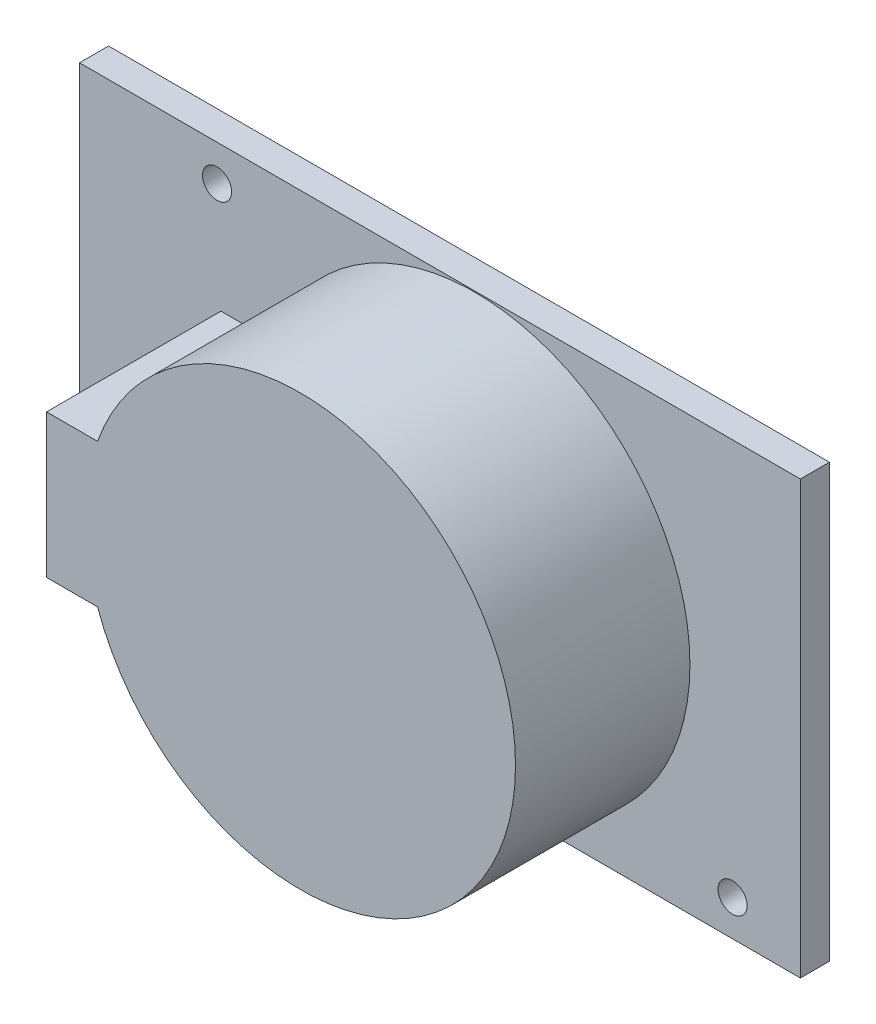
ISO-10303-21;
HEADER;
FILE_DESCRIPTION(('STEP AP214'),'2;1');
FILE_NAME('part.step','',(''),(''),'','','');
FILE_SCHEMA(('AUTOMOTIVE_DESIGN { 1 0 10303 214 1 1 1 1 }'));
ENDSEC;
DATA;
#1=APPLICATION_CONTEXT('core data for automotive mechanical design processes');
#2=APPLICATION_PROTOCOL_DEFINITION('international standard','automotive_design',2000,#1);
#3=PRODUCT_CONTEXT('',#1,'mechanical');
#4=PRODUCT('Part','Part','',(#3));
#5=PRODUCT_RELATED_PRODUCT_CATEGORY('part','',(#4));
#6=PRODUCT_DEFINITION_FORMATION('','',#4);
#7=PRODUCT_DEFINITION_CONTEXT('part definition',#1,'design');
#8=PRODUCT_DEFINITION('design','',#6,#7);
#9=PRODUCT_DEFINITION_SHAPE('','',#8);
#10=(LENGTH_UNIT() NAMED_UNIT(*) SI_UNIT(.MILLI.,.METRE.));
#11=(NAMED_UNIT(*) PLANE_ANGLE_UNIT() SI_UNIT($,.RADIAN.));
#12=(NAMED_UNIT(*) SI_UNIT($,.STERADIAN.) SOLID_ANGLE_UNIT());
#13=UNCERTAINTY_MEASURE_WITH_UNIT(LENGTH_MEASURE(1.E-05),#10,'distance_accuracy_value','');
#14=(GEOMETRIC_REPRESENTATION_CONTEXT(3) GLOBAL_UNCERTAINTY_ASSIGNED_CONTEXT((#13)) GLOBAL_UNIT_ASSIGNED_CONTEXT((#10,
#11,#12)) REPRESENTATION_CONTEXT('',''));
#15=CARTESIAN_POINT('',(0.,0.,0.));
#16=DIRECTION('',(0.,0.,1.));
#17=DIRECTION('',(1.,0.,0.));
#18=AXIS2_PLACEMENT_3D('',#15,#16,#17);
#19=CARTESIAN_POINT('',(0.,0.,3.5));
#20=DIRECTION('',(0.,0.,1.));
#21=DIRECTION('',(1.,0.,0.));
#22=AXIS2_PLACEMENT_3D('',#19,#20,#21);
#23=PLANE('',#22);
#24=CARTESIAN_POINT('',(52.2392585779876,8.59346025139325,3.5));
#25=DIRECTION('',(0.,0.,1.));
#26=DIRECTION('',(1.,0.,0.));
#27=AXIS2_PLACEMENT_3D('',#24,#25,#26);
#28=CIRCLE('',#27,0.749999999999999);
#29=CARTESIAN_POINT('',(52.9892585779876,8.59346025139325,3.5));
#30=VERTEX_POINT('',#29);
#31=EDGE_CURVE('E176',#30,#30,#28,.T.);
#32=ORIENTED_EDGE('',*,*,#31,.T.);
#33=EDGE_LOOP('',(#32));
#34=FACE_BOUND('',#33,.T.);
#35=CARTESIAN_POINT('',(78.8392585779876,8.59346025139325,3.5));
#36=DIRECTION('',(0.,0.,1.));
#37=DIRECTION('',(1.,0.,0.));
#38=AXIS2_PLACEMENT_3D('',#35,#36,#37);
#39=CIRCLE('',#38,0.749999999999999);
#40=CARTESIAN_POINT('',(79.5892585779876,8.59346025139325,3.5));
#41=VERTEX_POINT('',#40);
#42=EDGE_CURVE('E182',#41,#41,#39,.T.);
#43=ORIENTED_EDGE('',*,*,#42,.T.);
#44=EDGE_LOOP('',(#43));
#45=FACE_BOUND('',#44,.T.);
#46=DIRECTION('',(0.,-1.,0.));
#47=VECTOR('',#46,1.);
#48=CARTESIAN_POINT('',(45.1392585779876,29.0434602513932,3.5));
#49=LINE('',#48,#47);
#50=CARTESIAN_POINT('',(45.1392585779876,29.0434602513932,3.5));
#51=VERTEX_POINT('',#50);
#52=CARTESIAN_POINT('',(45.1392585779876,6.74346025139325,3.5));
#53=VERTEX_POINT('',#52);
#54=EDGE_CURVE('E185',#51,#53,#49,.T.);
#55=ORIENTED_EDGE('',*,*,#54,.F.);
#56=DIRECTION('',(-1.,0.,0.));
#57=VECTOR('',#56,1.);
#58=CARTESIAN_POINT('',(45.1392585779876,29.0434602513932,3.5));
#59=LINE('',#58,#57);
#60=CARTESIAN_POINT('',(82.3392585779876,29.0434602513932,3.5));
#61=VERTEX_POINT('',#60);
#62=EDGE_CURVE('E194',#61,#51,#59,.T.);
#63=ORIENTED_EDGE('',*,*,#62,.F.);
#64=DIRECTION('',(0.,1.,0.));
#65=VECTOR('',#64,1.);
#66=CARTESIAN_POINT('',(82.3392585779876,29.0434602513932,3.5));
#67=LINE('',#66,#65);
#68=CARTESIAN_POINT('',(82.3392585779876,6.74346025139325,3.5));
#69=VERTEX_POINT('',#68);
#70=EDGE_CURVE('E191',#69,#61,#67,.T.);
#71=ORIENTED_EDGE('',*,*,#70,.F.);
#72=DIRECTION('',(1.,0.,0.));
#73=VECTOR('',#72,1.);
#74=CARTESIAN_POINT('',(45.1392585779876,6.74346025139325,3.5));
#75=LINE('',#74,#73);
#76=EDGE_CURVE('E188',#53,#69,#75,.T.);
#77=ORIENTED_EDGE('',*,*,#76,.F.);
#78=EDGE_LOOP('',(#55,#63,#71,#77));
#79=FACE_BOUND('',#78,.T.);
#80=CARTESIAN_POINT('',(52.2392585779876,27.1934602513932,3.5));
#81=DIRECTION('',(0.,0.,1.));
#82=DIRECTION('',(1.,0.,0.));
#83=AXIS2_PLACEMENT_3D('',#80,#81,#82);
#84=CIRCLE('',#83,0.749999999999999);
#85=CARTESIAN_POINT('',(52.9892585779876,27.1934602513932,3.5));
#86=VERTEX_POINT('',#85);
#87=EDGE_CURVE('E179',#86,#86,#84,.T.);
#88=ORIENTED_EDGE('',*,*,#87,.T.);
#89=EDGE_LOOP('',(#88));
#90=FACE_BOUND('',#89,.T.);
#91=DIRECTION('',(0.,-1.,0.));
#92=VECTOR('',#91,1.);
#93=CARTESIAN_POINT('',(71.8392585779876,17.7434602513932,3.5));
#94=LINE('',#93,#92);
#95=CARTESIAN_POINT('',(71.8392585779876,17.7434602513932,3.5));
#96=VERTEX_POINT('',#95);
#97=CARTESIAN_POINT('',(71.8392585779876,10.2434602513932,3.5));
#98=VERTEX_POINT('',#97);
#99=EDGE_CURVE('E141',#96,#98,#94,.T.);
#100=ORIENTED_EDGE('',*,*,#99,.F.);
#101=DIRECTION('',(1.,0.,0.));
#102=VECTOR('',#101,1.);
#103=CARTESIAN_POINT('',(71.8392585779876,17.7434602513932,3.5));
#104=LINE('',#103,#102);
#105=CARTESIAN_POINT('',(61.4392585779876,17.7434602513932,3.5));
#106=VERTEX_POINT('',#105);
#107=EDGE_CURVE('E138',#106,#96,#104,.T.);
#108=ORIENTED_EDGE('',*,*,#107,.F.);
#109=DIRECTION('',(0.,1.,0.));
#110=VECTOR('',#109,1.);
#111=CARTESIAN_POINT('',(61.4392585779876,17.7434602513932,3.5));
#112=LINE('',#111,#110);
#113=CARTESIAN_POINT('',(61.4392585779876,10.2434602513932,3.5));
#114=VERTEX_POINT('',#113);
#115=EDGE_CURVE('E52',#114,#106,#112,.T.);
#116=ORIENTED_EDGE('',*,*,#115,.F.);
#117=DIRECTION('',(-1.,0.,0.));
#118=VECTOR('',#117,1.);
#119=CARTESIAN_POINT('',(71.8392585779876,10.2434602513932,3.5));
#120=LINE('',#119,#118);
#121=EDGE_CURVE('E47',#98,#114,#120,.T.);
#122=ORIENTED_EDGE('',*,*,#121,.F.);
#123=EDGE_LOOP('',(#100,#108,#116,#122));
#124=FACE_BOUND('',#123,.T.);
#125=ADVANCED_FACE('F32',(#34,#45,#79,#90,#124),#23,.F.);
#126=CARTESIAN_POINT('',(0.,0.,5.));
#127=DIRECTION('',(0.,0.,1.));
#128=DIRECTION('',(1.,0.,0.));
#129=AXIS2_PLACEMENT_3D('',#126,#127,#128);
#130=PLANE('',#129);
#131=CARTESIAN_POINT('',(52.2392585779876,27.1934602513932,5.));
#132=DIRECTION('',(0.,0.,1.));
#133=DIRECTION('',(1.,0.,0.));
#134=AXIS2_PLACEMENT_3D('',#131,#132,#133);
#135=CIRCLE('',#134,0.749999999999999);
#136=CARTESIAN_POINT('',(52.9892585779876,27.1934602513932,5.));
#137=VERTEX_POINT('',#136);
#138=EDGE_CURVE('E200',#137,#137,#135,.T.);
#139=ORIENTED_EDGE('',*,*,#138,.F.);
#140=EDGE_LOOP('',(#139));
#141=FACE_BOUND('',#140,.T.);
#142=DIRECTION('',(0.,-1.,0.));
#143=VECTOR('',#142,1.);
#144=CARTESIAN_POINT('',(45.1392585779876,29.0434602513932,5.));
#145=LINE('',#144,#143);
#146=CARTESIAN_POINT('',(45.1392585779876,29.0434602513932,5.));
#147=VERTEX_POINT('',#146);
#148=CARTESIAN_POINT('',(45.1392585779876,6.74346025139325,5.));
#149=VERTEX_POINT('',#148);
#150=EDGE_CURVE('E206',#147,#149,#145,.T.);
#151=ORIENTED_EDGE('',*,*,#150,.T.);
#152=DIRECTION('',(1.,0.,0.));
#153=VECTOR('',#152,1.);
#154=CARTESIAN_POINT('',(45.1392585779876,6.74346025139325,5.));
#155=LINE('',#154,#153);
#156=CARTESIAN_POINT('',(82.3392585779876,6.74346025139325,5.));
#157=VERTEX_POINT('',#156);
#158=EDGE_CURVE('E209',#149,#157,#155,.T.);
#159=ORIENTED_EDGE('',*,*,#158,.T.);
#160=DIRECTION('',(0.,1.,0.));
#161=VECTOR('',#160,1.);
#162=CARTESIAN_POINT('',(82.3392585779876,29.0434602513932,5.));
#163=LINE('',#162,#161);
#164=CARTESIAN_POINT('',(82.3392585779876,29.0434602513932,5.));
#165=VERTEX_POINT('',#164);
#166=EDGE_CURVE('E211',#157,#165,#163,.T.);
#167=ORIENTED_EDGE('',*,*,#166,.T.);
#168=DIRECTION('',(-1.,0.,0.));
#169=VECTOR('',#168,1.);
#170=CARTESIAN_POINT('',(45.1392585779876,29.0434602513932,5.));
#171=LINE('',#170,#169);
#172=EDGE_CURVE('E213',#165,#147,#171,.T.);
#173=ORIENTED_EDGE('',*,*,#172,.T.);
#174=EDGE_LOOP('',(#151,#159,#167,#173));
#175=FACE_BOUND('',#174,.T.);
#176=CARTESIAN_POINT('',(78.8392585779876,8.59346025139325,5.));
#177=DIRECTION('',(0.,0.,1.));
#178=DIRECTION('',(1.,0.,0.));
#179=AXIS2_PLACEMENT_3D('',#176,#177,#178);
#180=CIRCLE('',#179,0.749999999999999);
#181=CARTESIAN_POINT('',(79.5892585779876,8.59346025139325,5.));
#182=VERTEX_POINT('',#181);
#183=EDGE_CURVE('E203',#182,#182,#180,.T.);
#184=ORIENTED_EDGE('',*,*,#183,.F.);
#185=EDGE_LOOP('',(#184));
#186=FACE_BOUND('',#185,.T.);
#187=CARTESIAN_POINT('',(52.2392585779876,8.59346025139325,5.));
#188=DIRECTION('',(0.,0.,1.));
#189=DIRECTION('',(1.,0.,0.));
#190=AXIS2_PLACEMENT_3D('',#187,#188,#189);
#191=CIRCLE('',#190,0.749999999999999);
#192=CARTESIAN_POINT('',(52.9892585779876,8.59346025139325,5.));
#193=VERTEX_POINT('',#192);
#194=EDGE_CURVE('E197',#193,#193,#191,.T.);
#195=ORIENTED_EDGE('',*,*,#194,.F.);
#196=EDGE_LOOP('',(#195));
#197=FACE_BOUND('',#196,.T.);
#198=DIRECTION('',(-1.,0.,0.));
#199=VECTOR('',#198,1.);
#200=CARTESIAN_POINT('',(52.4392585779876,21.5934602513932,5.));
#201=LINE('',#200,#199);
#202=CARTESIAN_POINT('',(55.0740782164266,21.5934602513932,5.));
#203=VERTEX_POINT('',#202);
#204=CARTESIAN_POINT('',(52.4392585779876,21.5934602513932,5.));
#205=VERTEX_POINT('',#204);
#206=EDGE_CURVE('E145',#203,#205,#201,.T.);
#207=ORIENTED_EDGE('',*,*,#206,.F.);
#208=CARTESIAN_POINT('',(65.5392585779876,17.8934602513932,5.));
#209=DIRECTION('',(0.,0.,1.));
#210=DIRECTION('',(1.,0.,0.));
#211=AXIS2_PLACEMENT_3D('',#208,#209,#210);
#212=CIRCLE('',#211,11.1);
#213=CARTESIAN_POINT('',(55.0740782164266,14.1934602513932,5.));
#214=VERTEX_POINT('',#213);
#215=EDGE_CURVE('E142',#214,#203,#212,.T.);
#216=ORIENTED_EDGE('',*,*,#215,.F.);
#217=DIRECTION('',(1.,0.,0.));
#218=VECTOR('',#217,1.);
#219=CARTESIAN_POINT('',(52.4392585779876,14.1934602513932,5.));
#220=LINE('',#219,#218);
#221=CARTESIAN_POINT('',(52.4392585779876,14.1934602513932,5.));
#222=VERTEX_POINT('',#221);
#223=EDGE_CURVE('E155',#222,#214,#220,.T.);
#224=ORIENTED_EDGE('',*,*,#223,.F.);
#225=DIRECTION('',(0.,-1.,0.));
#226=VECTOR('',#225,1.);
#227=CARTESIAN_POINT('',(52.4392585779876,14.1934602513932,5.));
#228=LINE('',#227,#226);
#229=EDGE_CURVE('E163',#205,#222,#228,.T.);
#230=ORIENTED_EDGE('',*,*,#229,.F.);
#231=EDGE_LOOP('',(#207,#216,#224,#230));
#232=FACE_BOUND('',#231,.T.);
#233=ADVANCED_FACE('F238',(#141,#175,#186,#197,#232),#130,.T.);
#234=CARTESIAN_POINT('',(45.1392585779876,29.0434602513932,5.));
#235=DIRECTION('',(1.,0.,0.));
#236=DIRECTION('',(0.,1.,0.));
#237=AXIS2_PLACEMENT_3D('',#234,#235,#236);
#238=PLANE('',#237);
#239=DIRECTION('',(0.,0.,-1.));
#240=VECTOR('',#239,1.);
#241=CARTESIAN_POINT('',(45.1392585779876,29.0434602513932,5.));
#242=LINE('',#241,#240);
#243=EDGE_CURVE('E215',#147,#51,#242,.T.);
#244=ORIENTED_EDGE('',*,*,#243,.T.);
#245=ORIENTED_EDGE('',*,*,#54,.T.);
#246=DIRECTION('',(0.,0.,-1.));
#247=VECTOR('',#246,1.);
#248=CARTESIAN_POINT('',(45.1392585779876,6.74346025139325,5.));
#249=LINE('',#248,#247);
#250=EDGE_CURVE('E11',#149,#53,#249,.T.);
#251=ORIENTED_EDGE('',*,*,#250,.F.);
#252=ORIENTED_EDGE('',*,*,#150,.F.);
#253=EDGE_LOOP('',(#244,#245,#251,#252));
#254=FACE_BOUND('',#253,.T.);
#255=ADVANCED_FACE('F34',(#254),#238,.F.);
#256=CARTESIAN_POINT('',(45.1392585779876,6.74346025139325,5.));
#257=DIRECTION('',(0.,1.,0.));
#258=DIRECTION('',(0.,0.,1.));
#259=AXIS2_PLACEMENT_3D('',#256,#257,#258);
#260=PLANE('',#259);
#261=ORIENTED_EDGE('',*,*,#250,.T.);
#262=ORIENTED_EDGE('',*,*,#76,.T.);
#263=DIRECTION('',(0.,0.,-1.));
#264=VECTOR('',#263,1.);
#265=CARTESIAN_POINT('',(82.3392585779876,6.74346025139325,5.));
#266=LINE('',#265,#264);
#267=EDGE_CURVE('E40',#157,#69,#266,.T.);
#268=ORIENTED_EDGE('',*,*,#267,.F.);
#269=ORIENTED_EDGE('',*,*,#158,.F.);
#270=EDGE_LOOP('',(#261,#262,#268,#269));
#271=FACE_BOUND('',#270,.T.);
#272=ADVANCED_FACE('F227',(#271),#260,.F.);
#273=CARTESIAN_POINT('',(82.3392585779876,29.0434602513932,5.));
#274=DIRECTION('',(-1.,0.,0.));
#275=DIRECTION('',(0.,-1.,0.));
#276=AXIS2_PLACEMENT_3D('',#273,#274,#275);
#277=PLANE('',#276);
#278=ORIENTED_EDGE('',*,*,#267,.T.);
#279=ORIENTED_EDGE('',*,*,#70,.T.);
#280=DIRECTION('',(0.,0.,-1.));
#281=VECTOR('',#280,1.);
#282=CARTESIAN_POINT('',(82.3392585779876,29.0434602513932,5.));
#283=LINE('',#282,#281);
#284=EDGE_CURVE('E218',#165,#61,#283,.T.);
#285=ORIENTED_EDGE('',*,*,#284,.F.);
#286=ORIENTED_EDGE('',*,*,#166,.F.);
#287=EDGE_LOOP('',(#278,#279,#285,#286));
#288=FACE_BOUND('',#287,.T.);
#289=ADVANCED_FACE('F224',(#288),#277,.F.);
#290=CARTESIAN_POINT('',(45.1392585779876,29.0434602513932,5.));
#291=DIRECTION('',(0.,-1.,0.));
#292=DIRECTION('',(0.,0.,-1.));
#293=AXIS2_PLACEMENT_3D('',#290,#291,#292);
#294=PLANE('',#293);
#295=ORIENTED_EDGE('',*,*,#284,.T.);
#296=ORIENTED_EDGE('',*,*,#62,.T.);
#297=ORIENTED_EDGE('',*,*,#243,.F.);
#298=ORIENTED_EDGE('',*,*,#172,.F.);
#299=EDGE_LOOP('',(#295,#296,#297,#298));
#300=FACE_BOUND('',#299,.T.);
#301=ADVANCED_FACE('F236',(#300),#294,.F.);
#302=CARTESIAN_POINT('',(78.8392585779876,8.59346025139325,5.));
#303=DIRECTION('',(0.,0.,-1.));
#304=DIRECTION('',(-1.,0.,0.));
#305=AXIS2_PLACEMENT_3D('',#302,#303,#304);
#306=CYLINDRICAL_SURFACE('',#305,0.749999999999999);
#307=ORIENTED_EDGE('',*,*,#42,.F.);
#308=EDGE_LOOP('',(#307));
#309=FACE_BOUND('',#308,.T.);
#310=ORIENTED_EDGE('',*,*,#183,.T.);
#311=EDGE_LOOP('',(#310));
#312=FACE_BOUND('',#311,.T.);
#313=ADVANCED_FACE('F292',(#309,#312),#306,.F.);
#314=CARTESIAN_POINT('',(52.2392585779876,27.1934602513932,5.));
#315=DIRECTION('',(0.,0.,-1.));
#316=DIRECTION('',(-1.,0.,0.));
#317=AXIS2_PLACEMENT_3D('',#314,#315,#316);
#318=CYLINDRICAL_SURFACE('',#317,0.749999999999999);
#319=ORIENTED_EDGE('',*,*,#87,.F.);
#320=EDGE_LOOP('',(#319));
#321=FACE_BOUND('',#320,.T.);
#322=ORIENTED_EDGE('',*,*,#138,.T.);
#323=EDGE_LOOP('',(#322));
#324=FACE_BOUND('',#323,.T.);
#325=ADVANCED_FACE('F288',(#321,#324),#318,.F.);
#326=CARTESIAN_POINT('',(52.2392585779876,8.59346025139325,5.));
#327=DIRECTION('',(0.,0.,-1.));
#328=DIRECTION('',(-1.,0.,0.));
#329=AXIS2_PLACEMENT_3D('',#326,#327,#328);
#330=CYLINDRICAL_SURFACE('',#329,0.749999999999999);
#331=ORIENTED_EDGE('',*,*,#31,.F.);
#332=EDGE_LOOP('',(#331));
#333=FACE_BOUND('',#332,.T.);
#334=ORIENTED_EDGE('',*,*,#194,.T.);
#335=EDGE_LOOP('',(#334));
#336=FACE_BOUND('',#335,.T.);
#337=ADVANCED_FACE('F285',(#333,#336),#330,.F.);
#338=CARTESIAN_POINT('',(65.5392585779876,17.8934602513932,14.));
#339=DIRECTION('',(0.,0.,-1.));
#340=DIRECTION('',(-1.,0.,0.));
#341=AXIS2_PLACEMENT_3D('',#338,#339,#340);
#342=CYLINDRICAL_SURFACE('',#341,11.1);
#343=ORIENTED_EDGE('',*,*,#215,.T.);
#344=DIRECTION('',(0.,0.,-1.));
#345=VECTOR('',#344,1.);
#346=CARTESIAN_POINT('',(55.0740782164266,21.5934602513932,14.));
#347=LINE('',#346,#345);
#348=CARTESIAN_POINT('',(55.0740782164266,21.5934602513932,14.));
#349=VERTEX_POINT('',#348);
#350=EDGE_CURVE('E174',#349,#203,#347,.T.);
#351=ORIENTED_EDGE('',*,*,#350,.F.);
#352=CARTESIAN_POINT('',(65.5392585779876,17.8934602513932,14.));
#353=DIRECTION('',(0.,0.,1.));
#354=DIRECTION('',(1.,0.,0.));
#355=AXIS2_PLACEMENT_3D('',#352,#353,#354);
#356=CIRCLE('',#355,11.1);
#357=CARTESIAN_POINT('',(55.0740782164266,14.1934602513932,14.));
#358=VERTEX_POINT('',#357);
#359=EDGE_CURVE('E151',#358,#349,#356,.T.);
#360=ORIENTED_EDGE('',*,*,#359,.F.);
#361=DIRECTION('',(0.,0.,-1.));
#362=VECTOR('',#361,1.);
#363=CARTESIAN_POINT('',(55.0740782164266,14.1934602513932,14.));
#364=LINE('',#363,#362);
#365=EDGE_CURVE('E160',#358,#214,#364,.T.);
#366=ORIENTED_EDGE('',*,*,#365,.T.);
#367=EDGE_LOOP('',(#343,#351,#360,#366));
#368=FACE_BOUND('',#367,.T.);
#369=ADVANCED_FACE('F265',(#368),#342,.T.);
#370=CARTESIAN_POINT('',(52.4392585779876,21.5934602513932,14.));
#371=DIRECTION('',(0.,-1.,0.));
#372=DIRECTION('',(0.,0.,-1.));
#373=AXIS2_PLACEMENT_3D('',#370,#371,#372);
#374=PLANE('',#373);
#375=ORIENTED_EDGE('',*,*,#206,.T.);
#376=DIRECTION('',(0.,0.,-1.));
#377=VECTOR('',#376,1.);
#378=CARTESIAN_POINT('',(52.4392585779876,21.5934602513932,14.));
#379=LINE('',#378,#377);
#380=CARTESIAN_POINT('',(52.4392585779876,21.5934602513932,14.));
#381=VERTEX_POINT('',#380);
#382=EDGE_CURVE('E171',#381,#205,#379,.T.);
#383=ORIENTED_EDGE('',*,*,#382,.F.);
#384=DIRECTION('',(-1.,0.,0.));
#385=VECTOR('',#384,1.);
#386=CARTESIAN_POINT('',(52.4392585779876,21.5934602513932,14.));
#387=LINE('',#386,#385);
#388=EDGE_CURVE('E154',#349,#381,#387,.T.);
#389=ORIENTED_EDGE('',*,*,#388,.F.);
#390=ORIENTED_EDGE('',*,*,#350,.T.);
#391=EDGE_LOOP('',(#375,#383,#389,#390));
#392=FACE_BOUND('',#391,.T.);
#393=ADVANCED_FACE('F253',(#392),#374,.F.);
#394=CARTESIAN_POINT('',(52.4392585779876,14.1934602513932,14.));
#395=DIRECTION('',(1.,0.,0.));
#396=DIRECTION('',(0.,0.,-1.));
#397=AXIS2_PLACEMENT_3D('',#394,#395,#396);
#398=PLANE('',#397);
#399=ORIENTED_EDGE('',*,*,#229,.T.);
#400=DIRECTION('',(0.,0.,-1.));
#401=VECTOR('',#400,1.);
#402=CARTESIAN_POINT('',(52.4392585779876,14.1934602513932,14.));
#403=LINE('',#402,#401);
#404=CARTESIAN_POINT('',(52.4392585779876,14.1934602513932,14.));
#405=VERTEX_POINT('',#404);
#406=EDGE_CURVE('E169',#405,#222,#403,.T.);
#407=ORIENTED_EDGE('',*,*,#406,.F.);
#408=DIRECTION('',(0.,-1.,0.));
#409=VECTOR('',#408,1.);
#410=CARTESIAN_POINT('',(52.4392585779876,14.1934602513932,14.));
#411=LINE('',#410,#409);
#412=EDGE_CURVE('E157',#381,#405,#411,.T.);
#413=ORIENTED_EDGE('',*,*,#412,.F.);
#414=ORIENTED_EDGE('',*,*,#382,.T.);
#415=EDGE_LOOP('',(#399,#407,#413,#414));
#416=FACE_BOUND('',#415,.T.);
#417=ADVANCED_FACE('F257',(#416),#398,.F.);
#418=CARTESIAN_POINT('',(52.4392585779876,14.1934602513932,14.));
#419=DIRECTION('',(0.,1.,0.));
#420=DIRECTION('',(0.,0.,1.));
#421=AXIS2_PLACEMENT_3D('',#418,#419,#420);
#422=PLANE('',#421);
#423=ORIENTED_EDGE('',*,*,#223,.T.);
#424=ORIENTED_EDGE('',*,*,#365,.F.);
#425=DIRECTION('',(1.,0.,0.));
#426=VECTOR('',#425,1.);
#427=CARTESIAN_POINT('',(52.4392585779876,14.1934602513932,14.));
#428=LINE('',#427,#426);
#429=EDGE_CURVE('E159',#405,#358,#428,.T.);
#430=ORIENTED_EDGE('',*,*,#429,.F.);
#431=ORIENTED_EDGE('',*,*,#406,.T.);
#432=EDGE_LOOP('',(#423,#424,#430,#431));
#433=FACE_BOUND('',#432,.T.);
#434=ADVANCED_FACE('F267',(#433),#422,.F.);
#435=CARTESIAN_POINT('',(65.5392585779876,17.8934602513932,14.));
#436=DIRECTION('',(0.,0.,1.));
#437=DIRECTION('',(1.,0.,0.));
#438=AXIS2_PLACEMENT_3D('',#435,#436,#437);
#439=PLANE('',#438);
#440=ORIENTED_EDGE('',*,*,#359,.T.);
#441=ORIENTED_EDGE('',*,*,#388,.T.);
#442=ORIENTED_EDGE('',*,*,#412,.T.);
#443=ORIENTED_EDGE('',*,*,#429,.T.);
#444=EDGE_LOOP('',(#440,#441,#442,#443));
#445=FACE_BOUND('',#444,.T.);
#446=ADVANCED_FACE('F261',(#445),#439,.T.);
#447=CARTESIAN_POINT('',(71.8392585779876,17.7434602513932,0.));
#448=DIRECTION('',(-1.,0.,0.));
#449=DIRECTION('',(0.,0.,1.));
#450=AXIS2_PLACEMENT_3D('',#447,#448,#449);
#451=PLANE('',#450);
#452=ORIENTED_EDGE('',*,*,#99,.T.);
#453=DIRECTION('',(0.,0.,1.));
#454=VECTOR('',#453,1.);
#455=CARTESIAN_POINT('',(71.8392585779876,10.2434602513932,0.));
#456=LINE('',#455,#454);
#457=CARTESIAN_POINT('',(71.8392585779876,10.2434602513932,0.));
#458=VERTEX_POINT('',#457);
#459=EDGE_CURVE('E122',#458,#98,#456,.T.);
#460=ORIENTED_EDGE('',*,*,#459,.F.);
#461=DIRECTION('',(0.,-1.,0.));
#462=VECTOR('',#461,1.);
#463=CARTESIAN_POINT('',(71.8392585779876,17.7434602513932,0.));
#464=LINE('',#463,#462);
#465=CARTESIAN_POINT('',(71.8392585779876,17.7434602513932,0.));
#466=VERTEX_POINT('',#465);
#467=EDGE_CURVE('E129',#466,#458,#464,.T.);
#468=ORIENTED_EDGE('',*,*,#467,.F.);
#469=DIRECTION('',(0.,0.,1.));
#470=VECTOR('',#469,1.);
#471=CARTESIAN_POINT('',(71.8392585779876,17.7434602513932,0.));
#472=LINE('',#471,#470);
#473=EDGE_CURVE('E398',#466,#96,#472,.T.);
#474=ORIENTED_EDGE('',*,*,#473,.T.);
#475=EDGE_LOOP('',(#452,#460,#468,#474));
#476=FACE_BOUND('',#475,.T.);
#477=ADVANCED_FACE('F140',(#476),#451,.F.);
#478=CARTESIAN_POINT('',(71.8392585779876,10.2434602513932,0.));
#479=DIRECTION('',(0.,1.,0.));
#480=DIRECTION('',(0.,0.,1.));
#481=AXIS2_PLACEMENT_3D('',#478,#479,#480);
#482=PLANE('',#481);
#483=ORIENTED_EDGE('',*,*,#121,.T.);
#484=DIRECTION('',(0.,0.,1.));
#485=VECTOR('',#484,1.);
#486=CARTESIAN_POINT('',(61.4392585779876,10.2434602513932,0.));
#487=LINE('',#486,#485);
#488=CARTESIAN_POINT('',(61.4392585779876,10.2434602513932,0.));
#489=VERTEX_POINT('',#488);
#490=EDGE_CURVE('E125',#489,#114,#487,.T.);
#491=ORIENTED_EDGE('',*,*,#490,.F.);
#492=DIRECTION('',(-1.,0.,0.));
#493=VECTOR('',#492,1.);
#494=CARTESIAN_POINT('',(71.8392585779876,10.2434602513932,0.));
#495=LINE('',#494,#493);
#496=EDGE_CURVE('E118',#458,#489,#495,.T.);
#497=ORIENTED_EDGE('',*,*,#496,.F.);
#498=ORIENTED_EDGE('',*,*,#459,.T.);
#499=EDGE_LOOP('',(#483,#491,#497,#498));
#500=FACE_BOUND('',#499,.T.);
#501=ADVANCED_FACE('F120',(#500),#482,.F.);
#502=CARTESIAN_POINT('',(61.4392585779876,17.7434602513932,0.));
#503=DIRECTION('',(1.,0.,0.));
#504=DIRECTION('',(0.,0.,-1.));
#505=AXIS2_PLACEMENT_3D('',#502,#503,#504);
#506=PLANE('',#505);
#507=ORIENTED_EDGE('',*,*,#115,.T.);
#508=DIRECTION('',(0.,0.,1.));
#509=VECTOR('',#508,1.);
#510=CARTESIAN_POINT('',(61.4392585779876,17.7434602513932,0.));
#511=LINE('',#510,#509);
#512=CARTESIAN_POINT('',(61.4392585779876,17.7434602513932,0.));
#513=VERTEX_POINT('',#512);
#514=EDGE_CURVE('E147',#513,#106,#511,.T.);
#515=ORIENTED_EDGE('',*,*,#514,.F.);
#516=DIRECTION('',(0.,1.,0.));
#517=VECTOR('',#516,1.);
#518=CARTESIAN_POINT('',(61.4392585779876,17.7434602513932,0.));
#519=LINE('',#518,#517);
#520=EDGE_CURVE('E128',#489,#513,#519,.T.);
#521=ORIENTED_EDGE('',*,*,#520,.F.);
#522=ORIENTED_EDGE('',*,*,#490,.T.);
#523=EDGE_LOOP('',(#507,#515,#521,#522));
#524=FACE_BOUND('',#523,.T.);
#525=ADVANCED_FACE('F365',(#524),#506,.F.);
#526=CARTESIAN_POINT('',(71.8392585779876,17.7434602513932,0.));
#527=DIRECTION('',(0.,-1.,0.));
#528=DIRECTION('',(0.,0.,-1.));
#529=AXIS2_PLACEMENT_3D('',#526,#527,#528);
#530=PLANE('',#529);
#531=ORIENTED_EDGE('',*,*,#107,.T.);
#532=ORIENTED_EDGE('',*,*,#473,.F.);
#533=DIRECTION('',(1.,0.,0.));
#534=VECTOR('',#533,1.);
#535=CARTESIAN_POINT('',(71.8392585779876,17.7434602513932,0.));
#536=LINE('',#535,#534);
#537=EDGE_CURVE('E134',#513,#466,#536,.T.);
#538=ORIENTED_EDGE('',*,*,#537,.F.);
#539=ORIENTED_EDGE('',*,*,#514,.T.);
#540=EDGE_LOOP('',(#531,#532,#538,#539));
#541=FACE_BOUND('',#540,.T.);
#542=ADVANCED_FACE('F374',(#541),#530,.F.);
#543=CARTESIAN_POINT('',(0.,0.,0.));
#544=DIRECTION('',(0.,0.,-1.));
#545=DIRECTION('',(-1.,0.,0.));
#546=AXIS2_PLACEMENT_3D('',#543,#544,#545);
#547=PLANE('',#546);
#548=ORIENTED_EDGE('',*,*,#467,.T.);
#549=ORIENTED_EDGE('',*,*,#496,.T.);
#550=ORIENTED_EDGE('',*,*,#520,.T.);
#551=ORIENTED_EDGE('',*,*,#537,.T.);
#552=EDGE_LOOP('',(#548,#549,#550,#551));
#553=FACE_BOUND('',#552,.T.);
#554=ADVANCED_FACE('F132',(#553),#547,.T.);
#555=CLOSED_SHELL('',(#125,#233,#255,#272,#289,#301,#313,#325,#337,#369,#393,#417,#434,#446,
#477,#501,#525,#542,#554));
#556=MANIFOLD_SOLID_BREP('B2',#555);
#557=ADVANCED_BREP_SHAPE_REPRESENTATION('',(#18,#556),#14);
#558=SHAPE_DEFINITION_REPRESENTATION(#9,#557);
ENDSEC;
END-ISO-10303-21;
